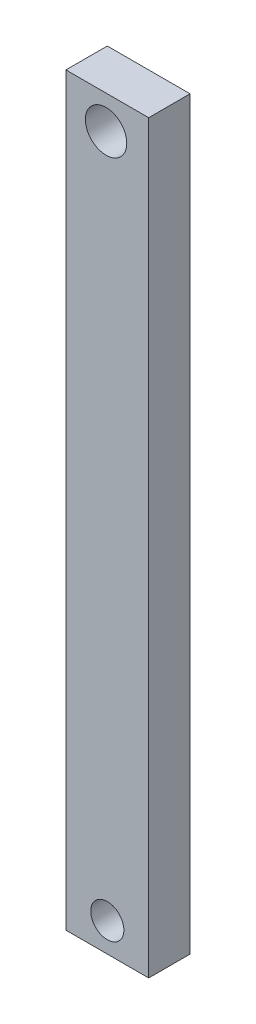
ISO-10303-21;
HEADER;
FILE_DESCRIPTION(('STEP AP214'),'2;1');
FILE_NAME('part.step','',(''),(''),'','','');
FILE_SCHEMA(('AUTOMOTIVE_DESIGN { 1 0 10303 214 1 1 1 1 }'));
ENDSEC;
DATA;
#1=APPLICATION_CONTEXT('core data for automotive mechanical design processes');
#2=APPLICATION_PROTOCOL_DEFINITION('international standard','automotive_design',2000,#1);
#3=PRODUCT_CONTEXT('',#1,'mechanical');
#4=PRODUCT('Part','Part','',(#3));
#5=PRODUCT_RELATED_PRODUCT_CATEGORY('part','',(#4));
#6=PRODUCT_DEFINITION_FORMATION('','',#4);
#7=PRODUCT_DEFINITION_CONTEXT('part definition',#1,'design');
#8=PRODUCT_DEFINITION('design','',#6,#7);
#9=PRODUCT_DEFINITION_SHAPE('','',#8);
#10=(LENGTH_UNIT() NAMED_UNIT(*) SI_UNIT(.MILLI.,.METRE.));
#11=(NAMED_UNIT(*) PLANE_ANGLE_UNIT() SI_UNIT($,.RADIAN.));
#12=(NAMED_UNIT(*) SI_UNIT($,.STERADIAN.) SOLID_ANGLE_UNIT());
#13=UNCERTAINTY_MEASURE_WITH_UNIT(LENGTH_MEASURE(1.E-05),#10,'distance_accuracy_value','');
#14=(GEOMETRIC_REPRESENTATION_CONTEXT(3) GLOBAL_UNCERTAINTY_ASSIGNED_CONTEXT((#13)) GLOBAL_UNIT_ASSIGNED_CONTEXT((#10,
#11,#12)) REPRESENTATION_CONTEXT('',''));
#15=CARTESIAN_POINT('',(0.,0.,0.));
#16=DIRECTION('',(0.,0.,1.));
#17=DIRECTION('',(1.,0.,0.));
#18=AXIS2_PLACEMENT_3D('',#15,#16,#17);
#19=CARTESIAN_POINT('',(-5.37190082644628,7.1694214876033,5.));
#20=DIRECTION('',(1.,0.,0.));
#21=DIRECTION('',(0.,1.,0.));
#22=AXIS2_PLACEMENT_3D('',#19,#20,#21);
#23=PLANE('',#22);
#24=DIRECTION('',(0.,-1.,0.));
#25=VECTOR('',#24,1.);
#26=CARTESIAN_POINT('',(-5.37190082644628,7.1694214876033,0.));
#27=LINE('',#26,#25);
#28=CARTESIAN_POINT('',(-5.37190082644628,7.1694214876033,0.));
#29=VERTEX_POINT('',#28);
#30=CARTESIAN_POINT('',(-5.37190082644627,-82.8305785123967,0.));
#31=VERTEX_POINT('',#30);
#32=EDGE_CURVE('E97',#29,#31,#27,.T.);
#33=ORIENTED_EDGE('',*,*,#32,.T.);
#34=DIRECTION('',(0.,0.,-1.));
#35=VECTOR('',#34,1.);
#36=CARTESIAN_POINT('',(-5.37190082644627,-82.8305785123967,5.));
#37=LINE('',#36,#35);
#38=CARTESIAN_POINT('',(-5.37190082644627,-82.8305785123967,5.));
#39=VERTEX_POINT('',#38);
#40=EDGE_CURVE('E11',#39,#31,#37,.T.);
#41=ORIENTED_EDGE('',*,*,#40,.F.);
#42=DIRECTION('',(0.,-1.,0.));
#43=VECTOR('',#42,1.);
#44=CARTESIAN_POINT('',(-5.37190082644628,7.1694214876033,5.));
#45=LINE('',#44,#43);
#46=CARTESIAN_POINT('',(-5.37190082644628,7.1694214876033,5.));
#47=VERTEX_POINT('',#46);
#48=EDGE_CURVE('E85',#47,#39,#45,.T.);
#49=ORIENTED_EDGE('',*,*,#48,.F.);
#50=DIRECTION('',(0.,0.,-1.));
#51=VECTOR('',#50,1.);
#52=CARTESIAN_POINT('',(-5.37190082644628,7.1694214876033,5.));
#53=LINE('',#52,#51);
#54=EDGE_CURVE('E93',#47,#29,#53,.T.);
#55=ORIENTED_EDGE('',*,*,#54,.T.);
#56=EDGE_LOOP('',(#33,#41,#49,#55));
#57=FACE_BOUND('',#56,.T.);
#58=ADVANCED_FACE('F34',(#57),#23,.F.);
#59=CARTESIAN_POINT('',(-5.37190082644627,-82.8305785123967,5.));
#60=DIRECTION('',(0.,1.,0.));
#61=DIRECTION('',(0.,0.,1.));
#62=AXIS2_PLACEMENT_3D('',#59,#60,#61);
#63=PLANE('',#62);
#64=DIRECTION('',(1.,0.,0.));
#65=VECTOR('',#64,1.);
#66=CARTESIAN_POINT('',(-5.37190082644627,-82.8305785123967,0.));
#67=LINE('',#66,#65);
#68=CARTESIAN_POINT('',(4.62809917355373,-82.8305785123967,0.));
#69=VERTEX_POINT('',#68);
#70=EDGE_CURVE('E89',#31,#69,#67,.T.);
#71=ORIENTED_EDGE('',*,*,#70,.T.);
#72=DIRECTION('',(0.,0.,-1.));
#73=VECTOR('',#72,1.);
#74=CARTESIAN_POINT('',(4.62809917355373,-82.8305785123967,5.));
#75=LINE('',#74,#73);
#76=CARTESIAN_POINT('',(4.62809917355373,-82.8305785123967,5.));
#77=VERTEX_POINT('',#76);
#78=EDGE_CURVE('E42',#77,#69,#75,.T.);
#79=ORIENTED_EDGE('',*,*,#78,.F.);
#80=DIRECTION('',(1.,0.,0.));
#81=VECTOR('',#80,1.);
#82=CARTESIAN_POINT('',(-5.37190082644627,-82.8305785123967,5.));
#83=LINE('',#82,#81);
#84=EDGE_CURVE('E80',#39,#77,#83,.T.);
#85=ORIENTED_EDGE('',*,*,#84,.F.);
#86=ORIENTED_EDGE('',*,*,#40,.T.);
#87=EDGE_LOOP('',(#71,#79,#85,#86));
#88=FACE_BOUND('',#87,.T.);
#89=ADVANCED_FACE('F88',(#88),#63,.F.);
#90=CARTESIAN_POINT('',(4.62809917355372,7.1694214876033,5.));
#91=DIRECTION('',(-1.,0.,0.));
#92=DIRECTION('',(0.,-1.,0.));
#93=AXIS2_PLACEMENT_3D('',#90,#91,#92);
#94=PLANE('',#93);
#95=DIRECTION('',(0.,1.,0.));
#96=VECTOR('',#95,1.);
#97=CARTESIAN_POINT('',(4.62809917355372,7.1694214876033,0.));
#98=LINE('',#97,#96);
#99=CARTESIAN_POINT('',(4.62809917355372,7.1694214876033,0.));
#100=VERTEX_POINT('',#99);
#101=EDGE_CURVE('E67',#69,#100,#98,.T.);
#102=ORIENTED_EDGE('',*,*,#101,.T.);
#103=DIRECTION('',(0.,0.,-1.));
#104=VECTOR('',#103,1.);
#105=CARTESIAN_POINT('',(4.62809917355372,7.1694214876033,5.));
#106=LINE('',#105,#104);
#107=CARTESIAN_POINT('',(4.62809917355372,7.1694214876033,5.));
#108=VERTEX_POINT('',#107);
#109=EDGE_CURVE('E90',#108,#100,#106,.T.);
#110=ORIENTED_EDGE('',*,*,#109,.F.);
#111=DIRECTION('',(0.,1.,0.));
#112=VECTOR('',#111,1.);
#113=CARTESIAN_POINT('',(4.62809917355372,7.1694214876033,5.));
#114=LINE('',#113,#112);
#115=EDGE_CURVE('E83',#77,#108,#114,.T.);
#116=ORIENTED_EDGE('',*,*,#115,.F.);
#117=ORIENTED_EDGE('',*,*,#78,.T.);
#118=EDGE_LOOP('',(#102,#110,#116,#117));
#119=FACE_BOUND('',#118,.T.);
#120=ADVANCED_FACE('F91',(#119),#94,.F.);
#121=CARTESIAN_POINT('',(-5.37190082644628,7.1694214876033,5.));
#122=DIRECTION('',(0.,-1.,0.));
#123=DIRECTION('',(0.,0.,-1.));
#124=AXIS2_PLACEMENT_3D('',#121,#122,#123);
#125=PLANE('',#124);
#126=DIRECTION('',(-1.,0.,0.));
#127=VECTOR('',#126,1.);
#128=CARTESIAN_POINT('',(-5.37190082644628,7.1694214876033,0.));
#129=LINE('',#128,#127);
#130=EDGE_CURVE('E73',#100,#29,#129,.T.);
#131=ORIENTED_EDGE('',*,*,#130,.T.);
#132=ORIENTED_EDGE('',*,*,#54,.F.);
#133=DIRECTION('',(-1.,0.,0.));
#134=VECTOR('',#133,1.);
#135=CARTESIAN_POINT('',(-5.37190082644628,7.1694214876033,5.));
#136=LINE('',#135,#134);
#137=EDGE_CURVE('E50',#108,#47,#136,.T.);
#138=ORIENTED_EDGE('',*,*,#137,.F.);
#139=ORIENTED_EDGE('',*,*,#109,.T.);
#140=EDGE_LOOP('',(#131,#132,#138,#139));
#141=FACE_BOUND('',#140,.T.);
#142=ADVANCED_FACE('F105',(#141),#125,.F.);
#143=CARTESIAN_POINT('',(0.,0.,5.));
#144=DIRECTION('',(0.,0.,1.));
#145=DIRECTION('',(1.,0.,0.));
#146=AXIS2_PLACEMENT_3D('',#143,#144,#145);
#147=PLANE('',#146);
#148=CARTESIAN_POINT('',(-0.521726902526026,3.1694214876033,5.));
#149=DIRECTION('',(0.,0.,1.));
#150=DIRECTION('',(1.,0.,0.));
#151=AXIS2_PLACEMENT_3D('',#148,#149,#150);
#152=CIRCLE('',#151,2.5);
#153=CARTESIAN_POINT('',(1.97827309747397,3.1694214876033,5.));
#154=VERTEX_POINT('',#153);
#155=EDGE_CURVE('E117',#154,#154,#152,.T.);
#156=ORIENTED_EDGE('',*,*,#155,.F.);
#157=EDGE_LOOP('',(#156));
#158=FACE_BOUND('',#157,.T.);
#159=CARTESIAN_POINT('',(-0.37190082644627,-79.3305785123967,5.));
#160=DIRECTION('',(0.,0.,1.));
#161=DIRECTION('',(1.,0.,0.));
#162=AXIS2_PLACEMENT_3D('',#159,#160,#161);
#163=CIRCLE('',#162,2.);
#164=CARTESIAN_POINT('',(1.62809917355373,-79.3305785123967,5.));
#165=VERTEX_POINT('',#164);
#166=EDGE_CURVE('E111',#165,#165,#163,.T.);
#167=ORIENTED_EDGE('',*,*,#166,.F.);
#168=EDGE_LOOP('',(#167));
#169=FACE_BOUND('',#168,.T.);
#170=ORIENTED_EDGE('',*,*,#48,.T.);
#171=ORIENTED_EDGE('',*,*,#84,.T.);
#172=ORIENTED_EDGE('',*,*,#115,.T.);
#173=ORIENTED_EDGE('',*,*,#137,.T.);
#174=EDGE_LOOP('',(#170,#171,#172,#173));
#175=FACE_BOUND('',#174,.T.);
#176=ADVANCED_FACE('F81',(#158,#169,#175),#147,.T.);
#177=CARTESIAN_POINT('',(0.,0.,0.));
#178=DIRECTION('',(0.,0.,1.));
#179=DIRECTION('',(1.,0.,0.));
#180=AXIS2_PLACEMENT_3D('',#177,#178,#179);
#181=PLANE('',#180);
#182=CARTESIAN_POINT('',(-0.521726902526026,3.1694214876033,0.));
#183=DIRECTION('',(0.,0.,1.));
#184=DIRECTION('',(1.,0.,0.));
#185=AXIS2_PLACEMENT_3D('',#182,#183,#184);
#186=CIRCLE('',#185,2.5);
#187=CARTESIAN_POINT('',(1.97827309747397,3.1694214876033,0.));
#188=VERTEX_POINT('',#187);
#189=EDGE_CURVE('E100',#188,#188,#186,.T.);
#190=ORIENTED_EDGE('',*,*,#189,.T.);
#191=EDGE_LOOP('',(#190));
#192=FACE_BOUND('',#191,.T.);
#193=CARTESIAN_POINT('',(-0.37190082644627,-79.3305785123967,0.));
#194=DIRECTION('',(0.,0.,1.));
#195=DIRECTION('',(1.,0.,0.));
#196=AXIS2_PLACEMENT_3D('',#193,#194,#195);
#197=CIRCLE('',#196,2.);
#198=CARTESIAN_POINT('',(1.62809917355373,-79.3305785123967,0.));
#199=VERTEX_POINT('',#198);
#200=EDGE_CURVE('E114',#199,#199,#197,.T.);
#201=ORIENTED_EDGE('',*,*,#200,.T.);
#202=EDGE_LOOP('',(#201));
#203=FACE_BOUND('',#202,.T.);
#204=ORIENTED_EDGE('',*,*,#32,.F.);
#205=ORIENTED_EDGE('',*,*,#130,.F.);
#206=ORIENTED_EDGE('',*,*,#101,.F.);
#207=ORIENTED_EDGE('',*,*,#70,.F.);
#208=EDGE_LOOP('',(#204,#205,#206,#207));
#209=FACE_BOUND('',#208,.T.);
#210=ADVANCED_FACE('F108',(#192,#203,#209),#181,.F.);
#211=CARTESIAN_POINT('',(-0.37190082644627,-79.3305785123967,0.));
#212=DIRECTION('',(0.,0.,1.));
#213=DIRECTION('',(1.,0.,0.));
#214=AXIS2_PLACEMENT_3D('',#211,#212,#213);
#215=CYLINDRICAL_SURFACE('',#214,2.);
#216=ORIENTED_EDGE('',*,*,#200,.F.);
#217=EDGE_LOOP('',(#216));
#218=FACE_BOUND('',#217,.T.);
#219=ORIENTED_EDGE('',*,*,#166,.T.);
#220=EDGE_LOOP('',(#219));
#221=FACE_BOUND('',#220,.T.);
#222=ADVANCED_FACE('F128',(#218,#221),#215,.F.);
#223=CARTESIAN_POINT('',(-0.521726902526026,3.1694214876033,0.));
#224=DIRECTION('',(0.,0.,1.));
#225=DIRECTION('',(1.,0.,0.));
#226=AXIS2_PLACEMENT_3D('',#223,#224,#225);
#227=CYLINDRICAL_SURFACE('',#226,2.5);
#228=ORIENTED_EDGE('',*,*,#189,.F.);
#229=EDGE_LOOP('',(#228));
#230=FACE_BOUND('',#229,.T.);
#231=ORIENTED_EDGE('',*,*,#155,.T.);
#232=EDGE_LOOP('',(#231));
#233=FACE_BOUND('',#232,.T.);
#234=ADVANCED_FACE('F125',(#230,#233),#227,.F.);
#235=CLOSED_SHELL('',(#58,#89,#120,#142,#176,#210,#222,#234));
#236=MANIFOLD_SOLID_BREP('B2',#235);
#237=ADVANCED_BREP_SHAPE_REPRESENTATION('',(#18,#236),#14);
#238=SHAPE_DEFINITION_REPRESENTATION(#9,#237);
ENDSEC;
END-ISO-10303-21;
